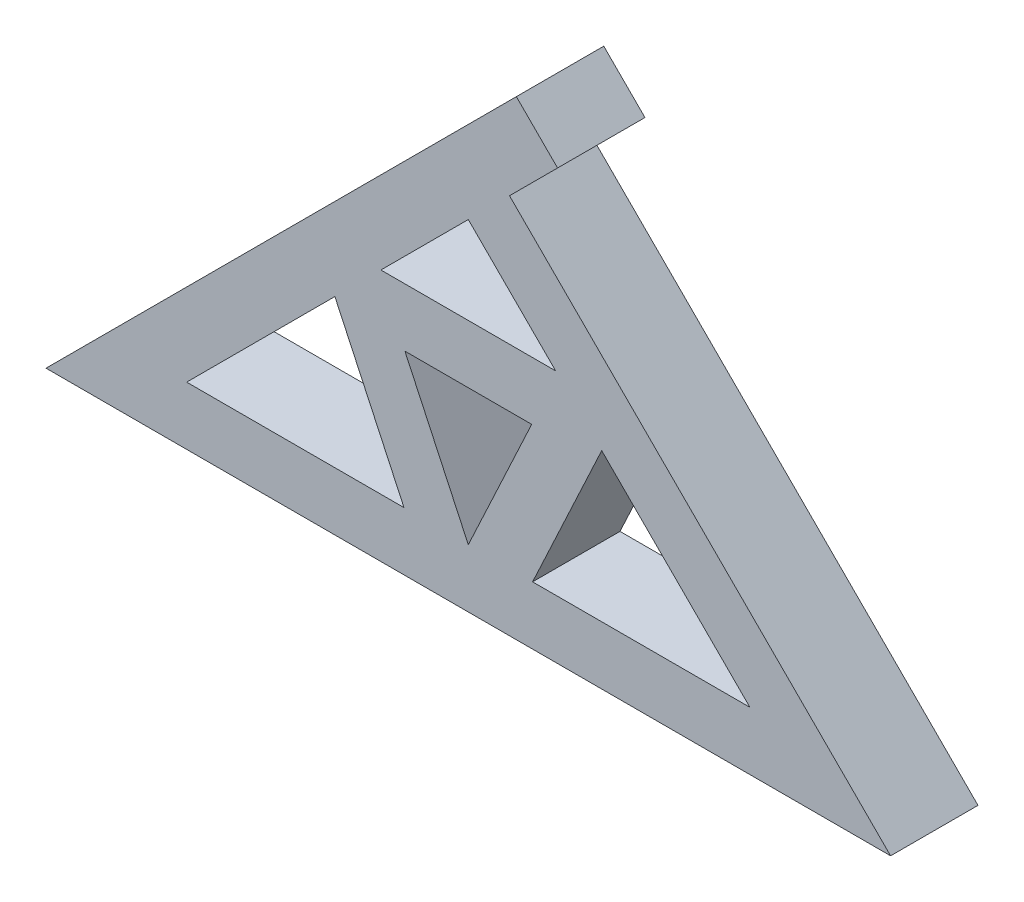
ISO-10303-21;
HEADER;
FILE_DESCRIPTION(('STEP AP214'),'2;1');
FILE_NAME('part.step','',(''),(''),'','','');
FILE_SCHEMA(('AUTOMOTIVE_DESIGN { 1 0 10303 214 1 1 1 1 }'));
ENDSEC;
DATA;
#1=APPLICATION_CONTEXT('core data for automotive mechanical design processes');
#2=APPLICATION_PROTOCOL_DEFINITION('international standard','automotive_design',2000,#1);
#3=PRODUCT_CONTEXT('',#1,'mechanical');
#4=PRODUCT('Part','Part','',(#3));
#5=PRODUCT_RELATED_PRODUCT_CATEGORY('part','',(#4));
#6=PRODUCT_DEFINITION_FORMATION('','',#4);
#7=PRODUCT_DEFINITION_CONTEXT('part definition',#1,'design');
#8=PRODUCT_DEFINITION('design','',#6,#7);
#9=PRODUCT_DEFINITION_SHAPE('','',#8);
#10=(LENGTH_UNIT() NAMED_UNIT(*) SI_UNIT(.MILLI.,.METRE.));
#11=(NAMED_UNIT(*) PLANE_ANGLE_UNIT() SI_UNIT($,.RADIAN.));
#12=(NAMED_UNIT(*) SI_UNIT($,.STERADIAN.) SOLID_ANGLE_UNIT());
#13=UNCERTAINTY_MEASURE_WITH_UNIT(LENGTH_MEASURE(1.E-05),#10,'distance_accuracy_value','');
#14=(GEOMETRIC_REPRESENTATION_CONTEXT(3) GLOBAL_UNCERTAINTY_ASSIGNED_CONTEXT((#13)) GLOBAL_UNIT_ASSIGNED_CONTEXT((#10,
#11,#12)) REPRESENTATION_CONTEXT('',''));
#15=CARTESIAN_POINT('',(0.,0.,0.));
#16=DIRECTION('',(0.,0.,1.));
#17=DIRECTION('',(1.,0.,0.));
#18=AXIS2_PLACEMENT_3D('',#15,#16,#17);
#19=CARTESIAN_POINT('',(12.7279220613578,0.,4.5));
#20=DIRECTION('',(-0.707106781186544,0.707106781186551,0.));
#21=DIRECTION('',(-0.707106781186551,-0.707106781186544,0.));
#22=AXIS2_PLACEMENT_3D('',#19,#20,#21);
#23=CYLINDRICAL_SURFACE('',#22,1.625);
#24=CARTESIAN_POINT('',(6.36396103067895,6.3639610306789,4.5));
#25=DIRECTION('',(-0.707106781186544,0.707106781186551,0.));
#26=DIRECTION('',(-0.707106781186551,-0.707106781186544,0.));
#27=AXIS2_PLACEMENT_3D('',#24,#25,#26);
#28=CIRCLE('',#27,1.625);
#29=CARTESIAN_POINT('',(5.21491251125081,5.21491251125077,4.5));
#30=VERTEX_POINT('',#29);
#31=EDGE_CURVE('E190',#30,#30,#28,.T.);
#32=ORIENTED_EDGE('',*,*,#31,.T.);
#33=EDGE_LOOP('',(#32));
#34=FACE_BOUND('',#33,.T.);
#35=CARTESIAN_POINT('',(8.48528137423859,4.24264068711924,4.5));
#36=DIRECTION('',(0.707106781186544,-0.707106781186551,0.));
#37=DIRECTION('',(0.707106781186551,0.707106781186544,0.));
#38=AXIS2_PLACEMENT_3D('',#35,#36,#37);
#39=CIRCLE('',#38,1.625);
#40=CARTESIAN_POINT('',(9.63432989366674,5.39168920654737,4.5));
#41=VERTEX_POINT('',#40);
#42=EDGE_CURVE('E294',#41,#41,#39,.F.);
#43=ORIENTED_EDGE('',*,*,#42,.F.);
#44=EDGE_LOOP('',(#43));
#45=FACE_BOUND('',#44,.T.);
#46=ADVANCED_FACE('F36',(#34,#45),#23,.F.);
#47=CARTESIAN_POINT('',(50.2045814642451,41.719300090006,4.5));
#48=DIRECTION('',(-0.707106781186544,0.707106781186551,0.));
#49=DIRECTION('',(-0.707106781186551,-0.707106781186544,0.));
#50=AXIS2_PLACEMENT_3D('',#47,#48,#49);
#51=CYLINDRICAL_SURFACE('',#50,1.625);
#52=CARTESIAN_POINT('',(45.9619407771258,45.9619407771253,4.5));
#53=DIRECTION('',(-0.707106781186544,0.707106781186551,0.));
#54=DIRECTION('',(-0.707106781186551,-0.707106781186544,0.));
#55=AXIS2_PLACEMENT_3D('',#52,#53,#54);
#56=CIRCLE('',#55,1.625);
#57=CARTESIAN_POINT('',(44.8128922576977,44.8128922576972,4.5));
#58=VERTEX_POINT('',#57);
#59=EDGE_CURVE('E180',#58,#58,#56,.T.);
#60=ORIENTED_EDGE('',*,*,#59,.T.);
#61=EDGE_LOOP('',(#60));
#62=FACE_BOUND('',#61,.T.);
#63=CARTESIAN_POINT('',(48.0832611206854,43.8406204335657,4.5));
#64=DIRECTION('',(0.707106781186544,-0.707106781186551,0.));
#65=DIRECTION('',(0.707106781186551,0.707106781186544,0.));
#66=AXIS2_PLACEMENT_3D('',#63,#64,#65);
#67=CIRCLE('',#66,1.625);
#68=CARTESIAN_POINT('',(49.2323096401136,44.9896689529938,4.5));
#69=VERTEX_POINT('',#68);
#70=EDGE_CURVE('E291',#69,#69,#67,.F.);
#71=ORIENTED_EDGE('',*,*,#70,.F.);
#72=EDGE_LOOP('',(#71));
#73=FACE_BOUND('',#72,.T.);
#74=ADVANCED_FACE('F324',(#62,#73),#51,.F.);
#75=CARTESIAN_POINT('',(43.4870670429724,43.4870670429729,9.));
#76=DIRECTION('',(-0.707106781186544,-0.707106781186551,0.));
#77=DIRECTION('',(0.707106781186551,-0.707106781186544,0.));
#78=AXIS2_PLACEMENT_3D('',#75,#76,#77);
#79=PLANE('',#78);
#80=DIRECTION('',(0.,0.,-1.));
#81=VECTOR('',#80,1.);
#82=CARTESIAN_POINT('',(47.7297077300922,39.2444263558531,0.));
#83=LINE('',#82,#81);
#84=CARTESIAN_POINT('',(47.7297077300922,39.2444263558532,9.));
#85=VERTEX_POINT('',#84);
#86=CARTESIAN_POINT('',(47.7297077300922,39.2444263558532,0.));
#87=VERTEX_POINT('',#86);
#88=EDGE_CURVE('E53',#85,#87,#83,.T.);
#89=ORIENTED_EDGE('',*,*,#88,.F.);
#90=DIRECTION('',(-0.707106781186551,0.707106781186544,0.));
#91=VECTOR('',#90,1.);
#92=CARTESIAN_POINT('',(43.4870670429724,43.4870670429729,9.));
#93=LINE('',#92,#91);
#94=CARTESIAN_POINT('',(86.9741340859458,0.,9.));
#95=VERTEX_POINT('',#94);
#96=EDGE_CURVE('E178',#95,#85,#93,.T.);
#97=ORIENTED_EDGE('',*,*,#96,.F.);
#98=DIRECTION('',(0.,0.,-1.));
#99=VECTOR('',#98,1.);
#100=CARTESIAN_POINT('',(86.9741340859458,0.,9.));
#101=LINE('',#100,#99);
#102=CARTESIAN_POINT('',(86.9741340859458,0.,0.));
#103=VERTEX_POINT('',#102);
#104=EDGE_CURVE('E45',#95,#103,#101,.T.);
#105=ORIENTED_EDGE('',*,*,#104,.T.);
#106=DIRECTION('',(-0.707106781186551,0.707106781186544,0.));
#107=VECTOR('',#106,1.);
#108=CARTESIAN_POINT('',(43.4870670429724,43.4870670429729,0.));
#109=LINE('',#108,#107);
#110=EDGE_CURVE('E58',#103,#87,#109,.T.);
#111=ORIENTED_EDGE('',*,*,#110,.T.);
#112=EDGE_LOOP('',(#89,#97,#105,#111));
#113=FACE_BOUND('',#112,.T.);
#114=ADVANCED_FACE('F313',(#113),#79,.F.);
#115=CARTESIAN_POINT('',(0.,0.,9.));
#116=DIRECTION('',(0.707106781186544,-0.707106781186551,0.));
#117=DIRECTION('',(0.707106781186551,0.707106781186544,0.));
#118=AXIS2_PLACEMENT_3D('',#115,#116,#117);
#119=PLANE('',#118);
#120=ORIENTED_EDGE('',*,*,#31,.F.);
#121=EDGE_LOOP('',(#120));
#122=FACE_BOUND('',#121,.T.);
#123=DIRECTION('',(-0.707106781186551,-0.707106781186544,0.));
#124=VECTOR('',#123,1.);
#125=CARTESIAN_POINT('',(0.,0.,0.));
#126=LINE('',#125,#124);
#127=CARTESIAN_POINT('',(48.4368145112787,48.4368145112782,0.));
#128=VERTEX_POINT('',#127);
#129=CARTESIAN_POINT('',(0.,0.,0.));
#130=VERTEX_POINT('',#129);
#131=EDGE_CURVE('E253',#128,#130,#126,.T.);
#132=ORIENTED_EDGE('',*,*,#131,.T.);
#133=DIRECTION('',(0.,0.,-1.));
#134=VECTOR('',#133,1.);
#135=CARTESIAN_POINT('',(0.,0.,9.));
#136=LINE('',#135,#134);
#137=CARTESIAN_POINT('',(0.,0.,9.));
#138=VERTEX_POINT('',#137);
#139=EDGE_CURVE('E11',#138,#130,#136,.T.);
#140=ORIENTED_EDGE('',*,*,#139,.F.);
#141=DIRECTION('',(-0.707106781186551,-0.707106781186544,0.));
#142=VECTOR('',#141,1.);
#143=CARTESIAN_POINT('',(0.,0.,9.));
#144=LINE('',#143,#142);
#145=CARTESIAN_POINT('',(48.4368145112788,48.4368145112782,9.));
#146=VERTEX_POINT('',#145);
#147=EDGE_CURVE('E222',#146,#138,#144,.T.);
#148=ORIENTED_EDGE('',*,*,#147,.F.);
#149=DIRECTION('',(0.,0.,1.));
#150=VECTOR('',#149,1.);
#151=CARTESIAN_POINT('',(48.4368145112788,48.4368145112782,0.));
#152=LINE('',#151,#150);
#153=EDGE_CURVE('E173',#128,#146,#152,.T.);
#154=ORIENTED_EDGE('',*,*,#153,.F.);
#155=EDGE_LOOP('',(#132,#140,#148,#154));
#156=FACE_BOUND('',#155,.T.);
#157=ORIENTED_EDGE('',*,*,#59,.F.);
#158=EDGE_LOOP('',(#157));
#159=FACE_BOUND('',#158,.T.);
#160=ADVANCED_FACE('F316',(#122,#156,#159),#119,.F.);
#161=CARTESIAN_POINT('',(0.,5.99999999999999,9.));
#162=DIRECTION('',(0.,-1.,0.));
#163=DIRECTION('',(1.,0.,0.));
#164=AXIS2_PLACEMENT_3D('',#161,#162,#163);
#165=PLANE('',#164);
#166=DIRECTION('',(-1.,0.,0.));
#167=VECTOR('',#166,1.);
#168=CARTESIAN_POINT('',(0.,5.99999999999999,0.));
#169=LINE('',#168,#167);
#170=CARTESIAN_POINT('',(72.4888527117071,5.99999999999999,0.));
#171=VERTEX_POINT('',#170);
#172=CARTESIAN_POINT('',(50.107334556748,6.,0.));
#173=VERTEX_POINT('',#172);
#174=EDGE_CURVE('E232',#171,#173,#169,.T.);
#175=ORIENTED_EDGE('',*,*,#174,.T.);
#176=DIRECTION('',(0.,0.,-1.));
#177=VECTOR('',#176,1.);
#178=CARTESIAN_POINT('',(50.107334556748,6.,9.));
#179=LINE('',#178,#177);
#180=CARTESIAN_POINT('',(50.107334556748,6.,9.));
#181=VERTEX_POINT('',#180);
#182=EDGE_CURVE('E256',#181,#173,#179,.T.);
#183=ORIENTED_EDGE('',*,*,#182,.F.);
#184=DIRECTION('',(-1.,0.,0.));
#185=VECTOR('',#184,1.);
#186=CARTESIAN_POINT('',(0.,5.99999999999999,9.));
#187=LINE('',#186,#185);
#188=CARTESIAN_POINT('',(72.4888527117071,5.99999999999999,9.));
#189=VERTEX_POINT('',#188);
#190=EDGE_CURVE('E202',#189,#181,#187,.T.);
#191=ORIENTED_EDGE('',*,*,#190,.F.);
#192=DIRECTION('',(0.,0.,-1.));
#193=VECTOR('',#192,1.);
#194=CARTESIAN_POINT('',(72.4888527117071,5.99999999999999,9.));
#195=LINE('',#194,#193);
#196=EDGE_CURVE('E258',#189,#171,#195,.T.);
#197=ORIENTED_EDGE('',*,*,#196,.T.);
#198=EDGE_LOOP('',(#175,#183,#191,#197));
#199=FACE_BOUND('',#198,.T.);
#200=ADVANCED_FACE('F319',(#199),#165,.F.);
#201=CARTESIAN_POINT('',(38.8597208527651,-18.1205854274097,9.));
#202=DIRECTION('',(0.906307787036651,-0.422618261740697,0.));
#203=DIRECTION('',(0.422618261740697,0.906307787036651,0.));
#204=AXIS2_PLACEMENT_3D('',#201,#202,#203);
#205=PLANE('',#204);
#206=DIRECTION('',(-0.422618261740697,-0.906307787036651,0.));
#207=VECTOR('',#206,1.);
#208=CARTESIAN_POINT('',(38.8597208527651,-18.1205854274097,0.));
#209=LINE('',#208,#207);
#210=CARTESIAN_POINT('',(57.2249904311806,21.2638622805263,0.));
#211=VERTEX_POINT('',#210);
#212=EDGE_CURVE('E249',#211,#173,#209,.T.);
#213=ORIENTED_EDGE('',*,*,#212,.F.);
#214=DIRECTION('',(0.,0.,-1.));
#215=VECTOR('',#214,1.);
#216=CARTESIAN_POINT('',(57.2249904311806,21.2638622805263,9.));
#217=LINE('',#216,#215);
#218=CARTESIAN_POINT('',(57.2249904311806,21.2638622805263,9.));
#219=VERTEX_POINT('',#218);
#220=EDGE_CURVE('E261',#219,#211,#217,.T.);
#221=ORIENTED_EDGE('',*,*,#220,.F.);
#222=DIRECTION('',(-0.422618261740697,-0.906307787036651,0.));
#223=VECTOR('',#222,1.);
#224=CARTESIAN_POINT('',(38.8597208527651,-18.1205854274097,9.));
#225=LINE('',#224,#223);
#226=EDGE_CURVE('E218',#219,#181,#225,.T.);
#227=ORIENTED_EDGE('',*,*,#226,.T.);
#228=ORIENTED_EDGE('',*,*,#182,.T.);
#229=EDGE_LOOP('',(#213,#221,#227,#228));
#230=FACE_BOUND('',#229,.T.);
#231=ADVANCED_FACE('F367',(#230),#205,.T.);
#232=CARTESIAN_POINT('',(33.4218741305452,-15.5848758569656,9.));
#233=DIRECTION('',(0.906307787036651,-0.422618261740697,0.));
#234=DIRECTION('',(0.422618261740697,0.906307787036651,0.));
#235=AXIS2_PLACEMENT_3D('',#232,#233,#234);
#236=PLANE('',#235);
#237=DIRECTION('',(-0.422618261740697,-0.906307787036651,0.));
#238=VECTOR('',#237,1.);
#239=CARTESIAN_POINT('',(33.4218741305452,-15.5848758569656,0.));
#240=LINE('',#239,#238);
#241=CARTESIAN_POINT('',(50.0162069281485,20.0017856687337,0.));
#242=VERTEX_POINT('',#241);
#243=CARTESIAN_POINT('',(43.4870670429731,6.,0.));
#244=VERTEX_POINT('',#243);
#245=EDGE_CURVE('E241',#242,#244,#240,.T.);
#246=ORIENTED_EDGE('',*,*,#245,.T.);
#247=DIRECTION('',(0.,0.,-1.));
#248=VECTOR('',#247,1.);
#249=CARTESIAN_POINT('',(43.4870670429731,6.,9.));
#250=LINE('',#249,#248);
#251=CARTESIAN_POINT('',(43.4870670429731,6.,9.));
#252=VERTEX_POINT('',#251);
#253=EDGE_CURVE('E262',#252,#244,#250,.T.);
#254=ORIENTED_EDGE('',*,*,#253,.F.);
#255=DIRECTION('',(-0.422618261740697,-0.906307787036651,0.));
#256=VECTOR('',#255,1.);
#257=CARTESIAN_POINT('',(33.4218741305452,-15.5848758569656,9.));
#258=LINE('',#257,#256);
#259=CARTESIAN_POINT('',(50.0162069281485,20.0017856687337,9.));
#260=VERTEX_POINT('',#259);
#261=EDGE_CURVE('E210',#260,#252,#258,.T.);
#262=ORIENTED_EDGE('',*,*,#261,.F.);
#263=DIRECTION('',(0.,0.,-1.));
#264=VECTOR('',#263,1.);
#265=CARTESIAN_POINT('',(50.0162069281485,20.0017856687337,9.));
#266=LINE('',#265,#264);
#267=EDGE_CURVE('E265',#260,#242,#266,.T.);
#268=ORIENTED_EDGE('',*,*,#267,.T.);
#269=EDGE_LOOP('',(#246,#254,#262,#268));
#270=FACE_BOUND('',#269,.T.);
#271=ADVANCED_FACE('F370',(#270),#236,.F.);
#272=CARTESIAN_POINT('',(38.0181407892588,17.7281501988465,9.));
#273=DIRECTION('',(-0.906307787036648,-0.422618261740704,0.));
#274=DIRECTION('',(0.422618261740704,-0.906307787036648,0.));
#275=AXIS2_PLACEMENT_3D('',#272,#273,#274);
#276=PLANE('',#275);
#277=DIRECTION('',(-0.422618261740704,0.906307787036648,0.));
#278=VECTOR('',#277,1.);
#279=CARTESIAN_POINT('',(38.0181407892588,17.7281501988465,0.));
#280=LINE('',#279,#278);
#281=CARTESIAN_POINT('',(36.9579271577976,20.0017856687337,0.));
#282=VERTEX_POINT('',#281);
#283=EDGE_CURVE('E245',#244,#282,#280,.T.);
#284=ORIENTED_EDGE('',*,*,#283,.T.);
#285=DIRECTION('',(0.,0.,-1.));
#286=VECTOR('',#285,1.);
#287=CARTESIAN_POINT('',(36.9579271577976,20.0017856687337,9.));
#288=LINE('',#287,#286);
#289=CARTESIAN_POINT('',(36.9579271577976,20.0017856687337,9.));
#290=VERTEX_POINT('',#289);
#291=EDGE_CURVE('E268',#290,#282,#288,.T.);
#292=ORIENTED_EDGE('',*,*,#291,.F.);
#293=DIRECTION('',(-0.422618261740704,0.906307787036648,0.));
#294=VECTOR('',#293,1.);
#295=CARTESIAN_POINT('',(38.0181407892588,17.7281501988465,9.));
#296=LINE('',#295,#294);
#297=EDGE_CURVE('E214',#252,#290,#296,.T.);
#298=ORIENTED_EDGE('',*,*,#297,.F.);
#299=ORIENTED_EDGE('',*,*,#253,.T.);
#300=EDGE_LOOP('',(#284,#292,#298,#299));
#301=FACE_BOUND('',#300,.T.);
#302=ADVANCED_FACE('F378',(#301),#276,.F.);
#303=CARTESIAN_POINT('',(0.,26.0017856687337,9.));
#304=DIRECTION('',(0.,1.,0.));
#305=DIRECTION('',(0.,0.,1.));
#306=AXIS2_PLACEMENT_3D('',#303,#304,#305);
#307=PLANE('',#306);
#308=DIRECTION('',(1.,0.,0.));
#309=VECTOR('',#308,1.);
#310=CARTESIAN_POINT('',(0.,26.0017856687337,0.));
#311=LINE('',#310,#309);
#312=CARTESIAN_POINT('',(34.487067042973,26.0017856687337,0.));
#313=VERTEX_POINT('',#312);
#314=CARTESIAN_POINT('',(52.4870670429732,26.0017856687337,0.));
#315=VERTEX_POINT('',#314);
#316=EDGE_CURVE('E234',#313,#315,#311,.T.);
#317=ORIENTED_EDGE('',*,*,#316,.F.);
#318=DIRECTION('',(0.,0.,-1.));
#319=VECTOR('',#318,1.);
#320=CARTESIAN_POINT('',(34.487067042973,26.0017856687337,9.));
#321=LINE('',#320,#319);
#322=CARTESIAN_POINT('',(34.487067042973,26.0017856687337,9.));
#323=VERTEX_POINT('',#322);
#324=EDGE_CURVE('E269',#323,#313,#321,.T.);
#325=ORIENTED_EDGE('',*,*,#324,.F.);
#326=DIRECTION('',(1.,0.,0.));
#327=VECTOR('',#326,1.);
#328=CARTESIAN_POINT('',(0.,26.0017856687337,9.));
#329=LINE('',#328,#327);
#330=CARTESIAN_POINT('',(52.4870670429732,26.0017856687337,9.));
#331=VERTEX_POINT('',#330);
#332=EDGE_CURVE('E204',#323,#331,#329,.T.);
#333=ORIENTED_EDGE('',*,*,#332,.T.);
#334=DIRECTION('',(0.,0.,-1.));
#335=VECTOR('',#334,1.);
#336=CARTESIAN_POINT('',(52.4870670429732,26.0017856687337,9.));
#337=LINE('',#336,#335);
#338=EDGE_CURVE('E274',#331,#315,#337,.T.);
#339=ORIENTED_EDGE('',*,*,#338,.T.);
#340=EDGE_LOOP('',(#317,#325,#333,#339));
#341=FACE_BOUND('',#340,.T.);
#342=ADVANCED_FACE('F381',(#341),#307,.T.);
#343=CARTESIAN_POINT('',(4.24264068711949,-4.24264068711953,9.));
#344=DIRECTION('',(-0.707106781186544,0.707106781186551,0.));
#345=DIRECTION('',(-0.707106781186551,-0.707106781186544,0.));
#346=AXIS2_PLACEMENT_3D('',#343,#344,#345);
#347=PLANE('',#346);
#348=DIRECTION('',(0.707106781186551,0.707106781186544,0.));
#349=VECTOR('',#348,1.);
#350=CARTESIAN_POINT('',(4.24264068711949,-4.24264068711953,0.));
#351=LINE('',#350,#349);
#352=CARTESIAN_POINT('',(43.4870670429731,35.0017856687337,0.));
#353=VERTEX_POINT('',#352);
#354=EDGE_CURVE('E235',#313,#353,#351,.T.);
#355=ORIENTED_EDGE('',*,*,#354,.T.);
#356=DIRECTION('',(0.,0.,-1.));
#357=VECTOR('',#356,1.);
#358=CARTESIAN_POINT('',(43.4870670429731,35.0017856687337,9.));
#359=LINE('',#358,#357);
#360=CARTESIAN_POINT('',(43.4870670429731,35.0017856687337,9.));
#361=VERTEX_POINT('',#360);
#362=EDGE_CURVE('E276',#361,#353,#359,.T.);
#363=ORIENTED_EDGE('',*,*,#362,.F.);
#364=DIRECTION('',(0.707106781186551,0.707106781186544,0.));
#365=VECTOR('',#364,1.);
#366=CARTESIAN_POINT('',(4.24264068711949,-4.24264068711953,9.));
#367=LINE('',#366,#365);
#368=EDGE_CURVE('E205',#323,#361,#367,.T.);
#369=ORIENTED_EDGE('',*,*,#368,.F.);
#370=ORIENTED_EDGE('',*,*,#324,.T.);
#371=EDGE_LOOP('',(#355,#363,#369,#370));
#372=FACE_BOUND('',#371,.T.);
#373=ADVANCED_FACE('F386',(#372),#347,.F.);
#374=CARTESIAN_POINT('',(32.5802940670389,15.1924406284023,9.));
#375=DIRECTION('',(0.906307787036648,0.422618261740704,0.));
#376=DIRECTION('',(-0.422618261740704,0.906307787036648,0.));
#377=AXIS2_PLACEMENT_3D('',#374,#375,#376);
#378=PLANE('',#377);
#379=DIRECTION('',(0.422618261740704,-0.906307787036648,0.));
#380=VECTOR('',#379,1.);
#381=CARTESIAN_POINT('',(32.5802940670389,15.1924406284023,0.));
#382=LINE('',#381,#380);
#383=CARTESIAN_POINT('',(29.7491436547655,21.2638622805262,0.));
#384=VERTEX_POINT('',#383);
#385=CARTESIAN_POINT('',(36.8667995291981,6.,0.));
#386=VERTEX_POINT('',#385);
#387=EDGE_CURVE('E194',#384,#386,#382,.T.);
#388=ORIENTED_EDGE('',*,*,#387,.T.);
#389=DIRECTION('',(0.,0.,-1.));
#390=VECTOR('',#389,1.);
#391=CARTESIAN_POINT('',(36.8667995291981,6.,9.));
#392=LINE('',#391,#390);
#393=CARTESIAN_POINT('',(36.8667995291981,6.,9.));
#394=VERTEX_POINT('',#393);
#395=EDGE_CURVE('E277',#394,#386,#392,.T.);
#396=ORIENTED_EDGE('',*,*,#395,.F.);
#397=DIRECTION('',(0.422618261740704,-0.906307787036648,0.));
#398=VECTOR('',#397,1.);
#399=CARTESIAN_POINT('',(32.5802940670389,15.1924406284023,9.));
#400=LINE('',#399,#398);
#401=CARTESIAN_POINT('',(29.7491436547655,21.2638622805262,9.));
#402=VERTEX_POINT('',#401);
#403=EDGE_CURVE('E195',#402,#394,#400,.T.);
#404=ORIENTED_EDGE('',*,*,#403,.F.);
#405=DIRECTION('',(0.,0.,-1.));
#406=VECTOR('',#405,1.);
#407=CARTESIAN_POINT('',(29.7491436547655,21.2638622805262,9.));
#408=LINE('',#407,#406);
#409=EDGE_CURVE('E226',#402,#384,#408,.T.);
#410=ORIENTED_EDGE('',*,*,#409,.T.);
#411=EDGE_LOOP('',(#388,#396,#404,#410));
#412=FACE_BOUND('',#411,.T.);
#413=ADVANCED_FACE('F38',(#412),#378,.F.);
#414=CARTESIAN_POINT('',(14.4852813742391,5.99999999999999,0.));
#415=VERTEX_POINT('',#414);
#416=EDGE_CURVE('E229',#386,#415,#169,.T.);
#417=ORIENTED_EDGE('',*,*,#416,.T.);
#418=DIRECTION('',(0.,0.,-1.));
#419=VECTOR('',#418,1.);
#420=CARTESIAN_POINT('',(14.4852813742391,5.99999999999999,9.));
#421=LINE('',#420,#419);
#422=CARTESIAN_POINT('',(14.4852813742391,5.99999999999999,9.));
#423=VERTEX_POINT('',#422);
#424=EDGE_CURVE('E283',#423,#415,#421,.T.);
#425=ORIENTED_EDGE('',*,*,#424,.F.);
#426=EDGE_CURVE('E198',#394,#423,#187,.T.);
#427=ORIENTED_EDGE('',*,*,#426,.F.);
#428=ORIENTED_EDGE('',*,*,#395,.T.);
#429=EDGE_LOOP('',(#417,#425,#427,#428));
#430=FACE_BOUND('',#429,.T.);
#431=ADVANCED_FACE('F364',(#430),#165,.F.);
#432=CARTESIAN_POINT('',(39.2444263558531,39.2444263558536,9.));
#433=DIRECTION('',(0.707106781186543,0.707106781186551,0.));
#434=DIRECTION('',(-0.707106781186552,0.707106781186544,0.));
#435=AXIS2_PLACEMENT_3D('',#432,#433,#434);
#436=PLANE('',#435);
#437=DIRECTION('',(0.707106781186552,-0.707106781186544,0.));
#438=VECTOR('',#437,1.);
#439=CARTESIAN_POINT('',(39.2444263558531,39.2444263558536,0.));
#440=LINE('',#439,#438);
#441=EDGE_CURVE('E242',#211,#171,#440,.T.);
#442=ORIENTED_EDGE('',*,*,#441,.T.);
#443=ORIENTED_EDGE('',*,*,#196,.F.);
#444=DIRECTION('',(0.707106781186552,-0.707106781186544,0.));
#445=VECTOR('',#444,1.);
#446=CARTESIAN_POINT('',(39.2444263558531,39.2444263558536,9.));
#447=LINE('',#446,#445);
#448=EDGE_CURVE('E211',#219,#189,#447,.T.);
#449=ORIENTED_EDGE('',*,*,#448,.F.);
#450=ORIENTED_EDGE('',*,*,#220,.T.);
#451=EDGE_LOOP('',(#442,#443,#449,#450));
#452=FACE_BOUND('',#451,.T.);
#453=ADVANCED_FACE('F360',(#452),#436,.F.);
#454=CARTESIAN_POINT('',(0.,20.0017856687337,9.));
#455=DIRECTION('',(0.,1.,0.));
#456=DIRECTION('',(0.,0.,1.));
#457=AXIS2_PLACEMENT_3D('',#454,#455,#456);
#458=PLANE('',#457);
#459=DIRECTION('',(1.,0.,0.));
#460=VECTOR('',#459,1.);
#461=CARTESIAN_POINT('',(0.,20.0017856687337,0.));
#462=LINE('',#461,#460);
#463=EDGE_CURVE('E247',#282,#242,#462,.T.);
#464=ORIENTED_EDGE('',*,*,#463,.T.);
#465=ORIENTED_EDGE('',*,*,#267,.F.);
#466=DIRECTION('',(1.,0.,0.));
#467=VECTOR('',#466,1.);
#468=CARTESIAN_POINT('',(0.,20.0017856687337,9.));
#469=LINE('',#468,#467);
#470=EDGE_CURVE('E216',#290,#260,#469,.T.);
#471=ORIENTED_EDGE('',*,*,#470,.F.);
#472=ORIENTED_EDGE('',*,*,#291,.T.);
#473=EDGE_LOOP('',(#464,#465,#471,#472));
#474=FACE_BOUND('',#473,.T.);
#475=ADVANCED_FACE('F363',(#474),#458,.F.);
#476=EDGE_CURVE('E238',#353,#315,#440,.T.);
#477=ORIENTED_EDGE('',*,*,#476,.T.);
#478=ORIENTED_EDGE('',*,*,#338,.F.);
#479=EDGE_CURVE('E208',#361,#331,#447,.T.);
#480=ORIENTED_EDGE('',*,*,#479,.F.);
#481=ORIENTED_EDGE('',*,*,#362,.T.);
#482=EDGE_LOOP('',(#477,#478,#480,#481));
#483=FACE_BOUND('',#482,.T.);
#484=ADVANCED_FACE('F366',(#483),#436,.F.);
#485=EDGE_CURVE('E231',#415,#384,#351,.T.);
#486=ORIENTED_EDGE('',*,*,#485,.T.);
#487=ORIENTED_EDGE('',*,*,#409,.F.);
#488=EDGE_CURVE('E201',#423,#402,#367,.T.);
#489=ORIENTED_EDGE('',*,*,#488,.F.);
#490=ORIENTED_EDGE('',*,*,#424,.T.);
#491=EDGE_LOOP('',(#486,#487,#489,#490));
#492=FACE_BOUND('',#491,.T.);
#493=ADVANCED_FACE('F306',(#492),#347,.F.);
#494=CARTESIAN_POINT('',(0.,0.,9.));
#495=DIRECTION('',(0.,1.,0.));
#496=DIRECTION('',(0.,0.,1.));
#497=AXIS2_PLACEMENT_3D('',#494,#495,#496);
#498=PLANE('',#497);
#499=CARTESIAN_POINT('',(12.7279220613578,0.,4.5));
#500=DIRECTION('',(0.,1.,0.));
#501=DIRECTION('',(-1.,0.,0.));
#502=AXIS2_PLACEMENT_3D('',#499,#500,#501);
#503=ELLIPSE('',#502,4.06586399182263,2.875);
#504=CARTESIAN_POINT('',(8.66205806953516,0.,4.5));
#505=VERTEX_POINT('',#504);
#506=EDGE_CURVE('E40',#505,#505,#503,.F.);
#507=ORIENTED_EDGE('',*,*,#506,.F.);
#508=EDGE_LOOP('',(#507));
#509=FACE_BOUND('',#508,.T.);
#510=DIRECTION('',(1.,0.,0.));
#511=VECTOR('',#510,1.);
#512=CARTESIAN_POINT('',(0.,0.,0.));
#513=LINE('',#512,#511);
#514=EDGE_CURVE('E199',#130,#103,#513,.T.);
#515=ORIENTED_EDGE('',*,*,#514,.T.);
#516=ORIENTED_EDGE('',*,*,#104,.F.);
#517=DIRECTION('',(1.,0.,0.));
#518=VECTOR('',#517,1.);
#519=CARTESIAN_POINT('',(0.,0.,9.));
#520=LINE('',#519,#518);
#521=EDGE_CURVE('E224',#138,#95,#520,.T.);
#522=ORIENTED_EDGE('',*,*,#521,.F.);
#523=ORIENTED_EDGE('',*,*,#139,.T.);
#524=EDGE_LOOP('',(#515,#516,#522,#523));
#525=FACE_BOUND('',#524,.T.);
#526=ADVANCED_FACE('F303',(#509,#525),#498,.F.);
#527=CARTESIAN_POINT('',(0.,0.,9.));
#528=DIRECTION('',(0.,0.,1.));
#529=DIRECTION('',(1.,0.,0.));
#530=AXIS2_PLACEMENT_3D('',#527,#528,#529);
#531=PLANE('',#530);
#532=ORIENTED_EDGE('',*,*,#403,.T.);
#533=ORIENTED_EDGE('',*,*,#426,.T.);
#534=ORIENTED_EDGE('',*,*,#488,.T.);
#535=EDGE_LOOP('',(#532,#533,#534));
#536=FACE_BOUND('',#535,.T.);
#537=ORIENTED_EDGE('',*,*,#332,.F.);
#538=ORIENTED_EDGE('',*,*,#368,.T.);
#539=ORIENTED_EDGE('',*,*,#479,.T.);
#540=EDGE_LOOP('',(#537,#538,#539));
#541=FACE_BOUND('',#540,.T.);
#542=ORIENTED_EDGE('',*,*,#261,.T.);
#543=ORIENTED_EDGE('',*,*,#297,.T.);
#544=ORIENTED_EDGE('',*,*,#470,.T.);
#545=EDGE_LOOP('',(#542,#543,#544));
#546=FACE_BOUND('',#545,.T.);
#547=ORIENTED_EDGE('',*,*,#190,.T.);
#548=ORIENTED_EDGE('',*,*,#226,.F.);
#549=ORIENTED_EDGE('',*,*,#448,.T.);
#550=EDGE_LOOP('',(#547,#548,#549));
#551=FACE_BOUND('',#550,.T.);
#552=ORIENTED_EDGE('',*,*,#96,.T.);
#553=DIRECTION('',(-0.707106781186551,-0.707106781186544,0.));
#554=VECTOR('',#553,1.);
#555=CARTESIAN_POINT('',(4.24264068711926,-4.24264068711931,9.));
#556=LINE('',#555,#554);
#557=CARTESIAN_POINT('',(52.679455198398,44.1941738241589,9.));
#558=VERTEX_POINT('',#557);
#559=EDGE_CURVE('E161',#558,#85,#556,.T.);
#560=ORIENTED_EDGE('',*,*,#559,.F.);
#561=DIRECTION('',(-0.707106781186544,0.707106781186551,0.));
#562=VECTOR('',#561,1.);
#563=CARTESIAN_POINT('',(52.679455198398,44.1941738241589,9.));
#564=LINE('',#563,#562);
#565=EDGE_CURVE('E170',#558,#146,#564,.T.);
#566=ORIENTED_EDGE('',*,*,#565,.T.);
#567=ORIENTED_EDGE('',*,*,#147,.T.);
#568=ORIENTED_EDGE('',*,*,#521,.T.);
#569=EDGE_LOOP('',(#552,#560,#566,#567,#568));
#570=FACE_BOUND('',#569,.T.);
#571=ADVANCED_FACE('F177',(#536,#541,#546,#551,#570),#531,.T.);
#572=CARTESIAN_POINT('',(0.,0.,0.));
#573=DIRECTION('',(0.,0.,1.));
#574=DIRECTION('',(1.,0.,0.));
#575=AXIS2_PLACEMENT_3D('',#572,#573,#574);
#576=PLANE('',#575);
#577=ORIENTED_EDGE('',*,*,#387,.F.);
#578=ORIENTED_EDGE('',*,*,#485,.F.);
#579=ORIENTED_EDGE('',*,*,#416,.F.);
#580=EDGE_LOOP('',(#577,#578,#579));
#581=FACE_BOUND('',#580,.T.);
#582=ORIENTED_EDGE('',*,*,#316,.T.);
#583=ORIENTED_EDGE('',*,*,#476,.F.);
#584=ORIENTED_EDGE('',*,*,#354,.F.);
#585=EDGE_LOOP('',(#582,#583,#584));
#586=FACE_BOUND('',#585,.T.);
#587=ORIENTED_EDGE('',*,*,#245,.F.);
#588=ORIENTED_EDGE('',*,*,#463,.F.);
#589=ORIENTED_EDGE('',*,*,#283,.F.);
#590=EDGE_LOOP('',(#587,#588,#589));
#591=FACE_BOUND('',#590,.T.);
#592=ORIENTED_EDGE('',*,*,#174,.F.);
#593=ORIENTED_EDGE('',*,*,#441,.F.);
#594=ORIENTED_EDGE('',*,*,#212,.T.);
#595=EDGE_LOOP('',(#592,#593,#594));
#596=FACE_BOUND('',#595,.T.);
#597=ORIENTED_EDGE('',*,*,#110,.F.);
#598=ORIENTED_EDGE('',*,*,#514,.F.);
#599=ORIENTED_EDGE('',*,*,#131,.F.);
#600=DIRECTION('',(-0.707106781186544,0.707106781186551,0.));
#601=VECTOR('',#600,1.);
#602=CARTESIAN_POINT('',(52.679455198398,44.1941738241589,0.));
#603=LINE('',#602,#601);
#604=CARTESIAN_POINT('',(52.679455198398,44.1941738241589,0.));
#605=VERTEX_POINT('',#604);
#606=EDGE_CURVE('E175',#605,#128,#603,.T.);
#607=ORIENTED_EDGE('',*,*,#606,.F.);
#608=DIRECTION('',(0.707106781186551,0.707106781186544,0.));
#609=VECTOR('',#608,1.);
#610=CARTESIAN_POINT('',(4.24264068711926,-4.24264068711931,0.));
#611=LINE('',#610,#609);
#612=EDGE_CURVE('E163',#87,#605,#611,.T.);
#613=ORIENTED_EDGE('',*,*,#612,.F.);
#614=EDGE_LOOP('',(#597,#598,#599,#607,#613));
#615=FACE_BOUND('',#614,.T.);
#616=ADVANCED_FACE('F314',(#581,#586,#591,#596,#615),#576,.F.);
#617=CARTESIAN_POINT('',(52.679455198398,44.1941738241589,0.));
#618=DIRECTION('',(-0.707106781186551,-0.707106781186544,0.));
#619=DIRECTION('',(0.707106781186544,-0.707106781186551,0.));
#620=AXIS2_PLACEMENT_3D('',#617,#618,#619);
#621=PLANE('',#620);
#622=ORIENTED_EDGE('',*,*,#153,.T.);
#623=ORIENTED_EDGE('',*,*,#565,.F.);
#624=DIRECTION('',(0.,0.,1.));
#625=VECTOR('',#624,1.);
#626=CARTESIAN_POINT('',(52.679455198398,44.1941738241589,0.));
#627=LINE('',#626,#625);
#628=EDGE_CURVE('E157',#605,#558,#627,.T.);
#629=ORIENTED_EDGE('',*,*,#628,.F.);
#630=ORIENTED_EDGE('',*,*,#606,.T.);
#631=EDGE_LOOP('',(#622,#623,#629,#630));
#632=FACE_BOUND('',#631,.T.);
#633=ADVANCED_FACE('F171',(#632),#621,.F.);
#634=CARTESIAN_POINT('',(4.24264068711926,-4.24264068711931,0.));
#635=DIRECTION('',(-0.707106781186544,0.707106781186551,0.));
#636=DIRECTION('',(-0.707106781186551,-0.707106781186544,0.));
#637=AXIS2_PLACEMENT_3D('',#634,#635,#636);
#638=PLANE('',#637);
#639=CARTESIAN_POINT('',(50.2045814642451,41.719300090006,4.5));
#640=DIRECTION('',(-0.707106781186544,0.707106781186551,0.));
#641=DIRECTION('',(-0.707106781186551,-0.707106781186544,0.));
#642=AXIS2_PLACEMENT_3D('',#639,#640,#641);
#643=CIRCLE('',#642,2.875);
#644=CARTESIAN_POINT('',(48.1716494683337,39.6863680940947,4.5));
#645=VERTEX_POINT('',#644);
#646=EDGE_CURVE('E288',#645,#645,#643,.F.);
#647=ORIENTED_EDGE('',*,*,#646,.F.);
#648=EDGE_LOOP('',(#647));
#649=FACE_BOUND('',#648,.T.);
#650=ORIENTED_EDGE('',*,*,#559,.T.);
#651=ORIENTED_EDGE('',*,*,#88,.T.);
#652=ORIENTED_EDGE('',*,*,#612,.T.);
#653=ORIENTED_EDGE('',*,*,#628,.T.);
#654=EDGE_LOOP('',(#650,#651,#652,#653));
#655=FACE_BOUND('',#654,.T.);
#656=ADVANCED_FACE('F159',(#649,#655),#638,.F.);
#657=CARTESIAN_POINT('',(48.0832611206854,43.8406204335657,4.5));
#658=DIRECTION('',(0.707106781186544,-0.707106781186551,0.));
#659=DIRECTION('',(0.707106781186551,0.707106781186544,0.));
#660=AXIS2_PLACEMENT_3D('',#657,#658,#659);
#661=PLANE('',#660);
#662=CARTESIAN_POINT('',(48.0832611206854,43.8406204335657,4.5));
#663=DIRECTION('',(0.707106781186544,-0.707106781186551,0.));
#664=DIRECTION('',(0.707106781186551,0.707106781186544,0.));
#665=AXIS2_PLACEMENT_3D('',#662,#663,#664);
#666=CIRCLE('',#665,2.875);
#667=CARTESIAN_POINT('',(50.1161931165968,45.873552429477,4.5));
#668=VERTEX_POINT('',#667);
#669=EDGE_CURVE('E292',#668,#668,#666,.T.);
#670=ORIENTED_EDGE('',*,*,#669,.T.);
#671=EDGE_LOOP('',(#670));
#672=FACE_BOUND('',#671,.T.);
#673=ORIENTED_EDGE('',*,*,#70,.T.);
#674=EDGE_LOOP('',(#673));
#675=FACE_BOUND('',#674,.T.);
#676=ADVANCED_FACE('F330',(#672,#675),#661,.T.);
#677=CARTESIAN_POINT('',(73.539105243401,18.3847763108498,4.5));
#678=DIRECTION('',(-0.707106781186544,0.707106781186551,0.));
#679=DIRECTION('',(-0.707106781186551,-0.707106781186544,0.));
#680=AXIS2_PLACEMENT_3D('',#677,#678,#679);
#681=CYLINDRICAL_SURFACE('',#680,2.875);
#682=ORIENTED_EDGE('',*,*,#669,.F.);
#683=EDGE_LOOP('',(#682));
#684=FACE_BOUND('',#683,.T.);
#685=ORIENTED_EDGE('',*,*,#646,.T.);
#686=EDGE_LOOP('',(#685));
#687=FACE_BOUND('',#686,.T.);
#688=ADVANCED_FACE('F332',(#684,#687),#681,.F.);
#689=CARTESIAN_POINT('',(33.9411254969542,-21.2132034355966,4.5));
#690=DIRECTION('',(-0.707106781186544,0.707106781186551,0.));
#691=DIRECTION('',(-0.707106781186551,-0.707106781186544,0.));
#692=AXIS2_PLACEMENT_3D('',#689,#690,#691);
#693=CYLINDRICAL_SURFACE('',#692,2.875);
#694=CARTESIAN_POINT('',(8.48528137423859,4.24264068711924,4.5));
#695=DIRECTION('',(0.707106781186544,-0.707106781186551,0.));
#696=DIRECTION('',(0.707106781186551,0.707106781186544,0.));
#697=AXIS2_PLACEMENT_3D('',#694,#695,#696);
#698=CIRCLE('',#697,2.875);
#699=CARTESIAN_POINT('',(10.5182133701499,6.27557268303055,4.5));
#700=VERTEX_POINT('',#699);
#701=EDGE_CURVE('E183',#700,#700,#698,.T.);
#702=ORIENTED_EDGE('',*,*,#701,.F.);
#703=EDGE_LOOP('',(#702));
#704=FACE_BOUND('',#703,.T.);
#705=ORIENTED_EDGE('',*,*,#506,.T.);
#706=EDGE_LOOP('',(#705));
#707=FACE_BOUND('',#706,.T.);
#708=ADVANCED_FACE('F301',(#704,#707),#693,.F.);
#709=CARTESIAN_POINT('',(8.48528137423859,4.24264068711924,4.5));
#710=DIRECTION('',(0.707106781186544,-0.707106781186551,0.));
#711=DIRECTION('',(0.707106781186551,0.707106781186544,0.));
#712=AXIS2_PLACEMENT_3D('',#709,#710,#711);
#713=PLANE('',#712);
#714=ORIENTED_EDGE('',*,*,#701,.T.);
#715=EDGE_LOOP('',(#714));
#716=FACE_BOUND('',#715,.T.);
#717=ORIENTED_EDGE('',*,*,#42,.T.);
#718=EDGE_LOOP('',(#717));
#719=FACE_BOUND('',#718,.T.);
#720=ADVANCED_FACE('F514',(#716,#719),#713,.T.);
#721=CLOSED_SHELL('',(#46,#74,#114,#160,#200,#231,#271,#302,#342,#373,#413,#431,#453,#475,#484,
#493,#526,#571,#616,#633,#656,#676,#688,#708,#720));
#722=MANIFOLD_SOLID_BREP('B2',#721);
#723=ADVANCED_BREP_SHAPE_REPRESENTATION('',(#18,#722),#14);
#724=SHAPE_DEFINITION_REPRESENTATION(#9,#723);
ENDSEC;
END-ISO-10303-21;
